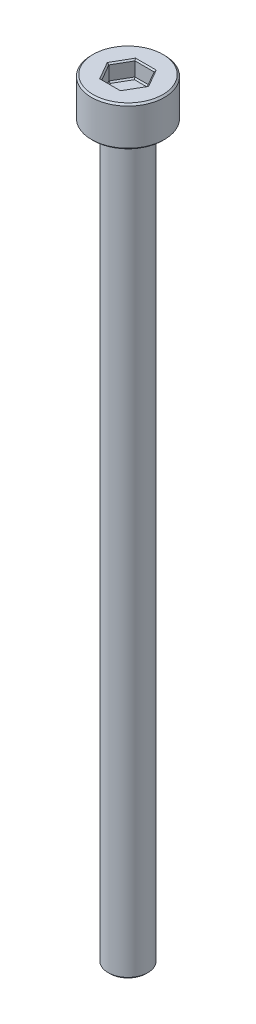
ISO-10303-21;
HEADER;
FILE_DESCRIPTION(('STEP AP214'),'2;1');
FILE_NAME('part.step','',(''),(''),'','','');
FILE_SCHEMA(('AUTOMOTIVE_DESIGN { 1 0 10303 214 1 1 1 1 }'));
ENDSEC;
DATA;
#1=APPLICATION_CONTEXT('core data for automotive mechanical design processes');
#2=APPLICATION_PROTOCOL_DEFINITION('international standard','automotive_design',2000,#1);
#3=PRODUCT_CONTEXT('',#1,'mechanical');
#4=PRODUCT('Part','Part','',(#3));
#5=PRODUCT_RELATED_PRODUCT_CATEGORY('part','',(#4));
#6=PRODUCT_DEFINITION_FORMATION('','',#4);
#7=PRODUCT_DEFINITION_CONTEXT('part definition',#1,'design');
#8=PRODUCT_DEFINITION('design','',#6,#7);
#9=PRODUCT_DEFINITION_SHAPE('','',#8);
#10=(LENGTH_UNIT() NAMED_UNIT(*) SI_UNIT(.MILLI.,.METRE.));
#11=(NAMED_UNIT(*) PLANE_ANGLE_UNIT() SI_UNIT($,.RADIAN.));
#12=(NAMED_UNIT(*) SI_UNIT($,.STERADIAN.) SOLID_ANGLE_UNIT());
#13=UNCERTAINTY_MEASURE_WITH_UNIT(LENGTH_MEASURE(1.E-05),#10,'distance_accuracy_value','');
#14=(GEOMETRIC_REPRESENTATION_CONTEXT(3) GLOBAL_UNCERTAINTY_ASSIGNED_CONTEXT((#13)) GLOBAL_UNIT_ASSIGNED_CONTEXT((#10,
#11,#12)) REPRESENTATION_CONTEXT('',''));
#15=CARTESIAN_POINT('',(0.,0.,0.));
#16=DIRECTION('',(0.,0.,1.));
#17=DIRECTION('',(1.,0.,0.));
#18=AXIS2_PLACEMENT_3D('',#15,#16,#17);
#19=CARTESIAN_POINT('',(0.,3.,0.));
#20=DIRECTION('',(0.,-1.,0.));
#21=DIRECTION('',(0.,0.,-1.));
#22=AXIS2_PLACEMENT_3D('',#19,#20,#21);
#23=CYLINDRICAL_SURFACE('',#22,2.75);
#24=CARTESIAN_POINT('',(0.,0.124999999999995,0.));
#25=DIRECTION('',(0.,1.,0.));
#26=DIRECTION('',(0.,0.,1.));
#27=AXIS2_PLACEMENT_3D('',#24,#25,#26);
#28=CIRCLE('',#27,2.75);
#29=CARTESIAN_POINT('',(0.,0.124999999999995,2.75));
#30=VERTEX_POINT('',#29);
#31=EDGE_CURVE('E274',#30,#30,#28,.T.);
#32=ORIENTED_EDGE('',*,*,#31,.T.);
#33=EDGE_LOOP('',(#32));
#34=FACE_BOUND('',#33,.T.);
#35=CARTESIAN_POINT('',(0.,2.87500000000001,0.));
#36=DIRECTION('',(0.,1.,0.));
#37=DIRECTION('',(0.,0.,1.));
#38=AXIS2_PLACEMENT_3D('',#35,#36,#37);
#39=CIRCLE('',#38,2.75);
#40=CARTESIAN_POINT('',(0.,2.87500000000001,2.75));
#41=VERTEX_POINT('',#40);
#42=EDGE_CURVE('E271',#41,#41,#39,.F.);
#43=ORIENTED_EDGE('',*,*,#42,.T.);
#44=EDGE_LOOP('',(#43));
#45=FACE_BOUND('',#44,.T.);
#46=ADVANCED_FACE('F43',(#34,#45),#23,.T.);
#47=CARTESIAN_POINT('',(0.,3.,0.));
#48=DIRECTION('',(0.,1.,0.));
#49=DIRECTION('',(0.,0.,1.));
#50=AXIS2_PLACEMENT_3D('',#47,#48,#49);
#51=PLANE('',#50);
#52=DIRECTION('',(-0.5,0.,0.866025403784439));
#53=VECTOR('',#52,1.);
#54=CARTESIAN_POINT('',(0.808290376865479,3.,1.3));
#55=LINE('',#54,#53);
#56=CARTESIAN_POINT('',(1.55884572681199,3.,0.));
#57=VERTEX_POINT('',#56);
#58=CARTESIAN_POINT('',(0.779422863405997,3.,1.35));
#59=VERTEX_POINT('',#58);
#60=EDGE_CURVE('E186',#57,#59,#55,.T.);
#61=ORIENTED_EDGE('',*,*,#60,.T.);
#62=DIRECTION('',(-1.,0.,0.));
#63=VECTOR('',#62,1.);
#64=CARTESIAN_POINT('',(-0.721687836487032,3.,1.35));
#65=LINE('',#64,#63);
#66=CARTESIAN_POINT('',(-0.779422863405996,3.,1.35));
#67=VERTEX_POINT('',#66);
#68=EDGE_CURVE('E158',#59,#67,#65,.T.);
#69=ORIENTED_EDGE('',*,*,#68,.T.);
#70=DIRECTION('',(-0.5,0.,-0.866025403784439));
#71=VECTOR('',#70,1.);
#72=CARTESIAN_POINT('',(-1.52997821335251,3.,0.0500000000000014));
#73=LINE('',#72,#71);
#74=CARTESIAN_POINT('',(-1.55884572681199,3.,0.));
#75=VERTEX_POINT('',#74);
#76=EDGE_CURVE('E182',#67,#75,#73,.T.);
#77=ORIENTED_EDGE('',*,*,#76,.T.);
#78=DIRECTION('',(0.5,0.,-0.866025403784439));
#79=VECTOR('',#78,1.);
#80=CARTESIAN_POINT('',(-0.808290376865479,3.,-1.3));
#81=LINE('',#80,#79);
#82=CARTESIAN_POINT('',(-0.779422863405997,3.,-1.35));
#83=VERTEX_POINT('',#82);
#84=EDGE_CURVE('E174',#75,#83,#81,.T.);
#85=ORIENTED_EDGE('',*,*,#84,.T.);
#86=DIRECTION('',(1.,0.,0.));
#87=VECTOR('',#86,1.);
#88=CARTESIAN_POINT('',(0.721687836487032,3.,-1.35));
#89=LINE('',#88,#87);
#90=CARTESIAN_POINT('',(0.779422863405996,3.,-1.35));
#91=VERTEX_POINT('',#90);
#92=EDGE_CURVE('E171',#83,#91,#89,.T.);
#93=ORIENTED_EDGE('',*,*,#92,.T.);
#94=DIRECTION('',(0.5,0.,0.866025403784439));
#95=VECTOR('',#94,1.);
#96=CARTESIAN_POINT('',(1.52997821335251,3.,-0.0500000000000015));
#97=LINE('',#96,#95);
#98=EDGE_CURVE('E184',#91,#57,#97,.T.);
#99=ORIENTED_EDGE('',*,*,#98,.T.);
#100=EDGE_LOOP('',(#61,#69,#77,#85,#93,#99));
#101=FACE_BOUND('',#100,.T.);
#102=CARTESIAN_POINT('',(0.,3.,0.));
#103=DIRECTION('',(0.,1.,0.));
#104=DIRECTION('',(0.,0.,1.));
#105=AXIS2_PLACEMENT_3D('',#102,#103,#104);
#106=CIRCLE('',#105,2.62500000000001);
#107=CARTESIAN_POINT('',(0.,3.,2.62500000000001));
#108=VERTEX_POINT('',#107);
#109=EDGE_CURVE('E280',#108,#108,#106,.T.);
#110=ORIENTED_EDGE('',*,*,#109,.T.);
#111=EDGE_LOOP('',(#110));
#112=FACE_BOUND('',#111,.T.);
#113=ADVANCED_FACE('F306',(#101,#112),#51,.T.);
#114=CARTESIAN_POINT('',(0.,0.,0.));
#115=DIRECTION('',(0.,1.,0.));
#116=DIRECTION('',(0.,0.,1.));
#117=AXIS2_PLACEMENT_3D('',#114,#115,#116);
#118=PLANE('',#117);
#119=CARTESIAN_POINT('',(0.,0.,0.));
#120=DIRECTION('',(0.,1.,0.));
#121=DIRECTION('',(0.,0.,1.));
#122=AXIS2_PLACEMENT_3D('',#119,#120,#121);
#123=CIRCLE('',#122,2.625);
#124=CARTESIAN_POINT('',(0.,0.,2.625));
#125=VERTEX_POINT('',#124);
#126=EDGE_CURVE('E277',#125,#125,#123,.F.);
#127=ORIENTED_EDGE('',*,*,#126,.T.);
#128=EDGE_LOOP('',(#127));
#129=FACE_BOUND('',#128,.T.);
#130=CARTESIAN_POINT('',(0.,0.,0.));
#131=DIRECTION('',(0.,-1.,0.));
#132=DIRECTION('',(0.,0.,-1.));
#133=AXIS2_PLACEMENT_3D('',#130,#131,#132);
#134=CIRCLE('',#133,1.5);
#135=CARTESIAN_POINT('',(0.,0.,-1.5));
#136=VERTEX_POINT('',#135);
#137=EDGE_CURVE('E147',#136,#136,#134,.T.);
#138=ORIENTED_EDGE('',*,*,#137,.F.);
#139=EDGE_LOOP('',(#138));
#140=FACE_BOUND('',#139,.T.);
#141=ADVANCED_FACE('F312',(#129,#140),#118,.F.);
#142=CARTESIAN_POINT('',(0.,-55.,0.));
#143=DIRECTION('',(0.,1.,0.));
#144=DIRECTION('',(0.,0.,1.));
#145=AXIS2_PLACEMENT_3D('',#142,#143,#144);
#146=CYLINDRICAL_SURFACE('',#145,1.5);
#147=CARTESIAN_POINT('',(0.,-54.875,0.));
#148=DIRECTION('',(0.,-1.,0.));
#149=DIRECTION('',(0.,0.,-1.));
#150=AXIS2_PLACEMENT_3D('',#147,#148,#149);
#151=CIRCLE('',#150,1.5);
#152=CARTESIAN_POINT('',(0.,-54.875,-1.5));
#153=VERTEX_POINT('',#152);
#154=EDGE_CURVE('E172',#153,#153,#151,.F.);
#155=ORIENTED_EDGE('',*,*,#154,.T.);
#156=EDGE_LOOP('',(#155));
#157=FACE_BOUND('',#156,.T.);
#158=ORIENTED_EDGE('',*,*,#137,.T.);
#159=EDGE_LOOP('',(#158));
#160=FACE_BOUND('',#159,.T.);
#161=ADVANCED_FACE('F432',(#157,#160),#146,.T.);
#162=CARTESIAN_POINT('',(0.,-55.,0.));
#163=DIRECTION('',(0.,-1.,0.));
#164=DIRECTION('',(0.,0.,-1.));
#165=AXIS2_PLACEMENT_3D('',#162,#163,#164);
#166=PLANE('',#165);
#167=CARTESIAN_POINT('',(0.,-55.,0.));
#168=DIRECTION('',(0.,-1.,0.));
#169=DIRECTION('',(0.,0.,-1.));
#170=AXIS2_PLACEMENT_3D('',#167,#168,#169);
#171=CIRCLE('',#170,1.37500000000001);
#172=CARTESIAN_POINT('',(0.,-55.,-1.37500000000001));
#173=VERTEX_POINT('',#172);
#174=EDGE_CURVE('E177',#173,#173,#171,.T.);
#175=ORIENTED_EDGE('',*,*,#174,.T.);
#176=EDGE_LOOP('',(#175));
#177=FACE_BOUND('',#176,.T.);
#178=ADVANCED_FACE('F285',(#177),#166,.T.);
#179=CARTESIAN_POINT('',(0.,0.124999999999995,0.));
#180=DIRECTION('',(0.,1.,0.));
#181=DIRECTION('',(0.,0.,1.));
#182=AXIS2_PLACEMENT_3D('',#179,#180,#181);
#183=CONICAL_SURFACE('',#182,2.75,0.785398163397459);
#184=ORIENTED_EDGE('',*,*,#126,.F.);
#185=EDGE_LOOP('',(#184));
#186=FACE_BOUND('',#185,.T.);
#187=ORIENTED_EDGE('',*,*,#31,.F.);
#188=EDGE_LOOP('',(#187));
#189=FACE_BOUND('',#188,.T.);
#190=ADVANCED_FACE('F299',(#186,#189),#183,.T.);
#191=CARTESIAN_POINT('',(0.,3.,0.));
#192=DIRECTION('',(0.,-1.,0.));
#193=DIRECTION('',(0.,0.,-1.));
#194=AXIS2_PLACEMENT_3D('',#191,#192,#193);
#195=CONICAL_SURFACE('',#194,2.62500000000001,0.785398163397466);
#196=ORIENTED_EDGE('',*,*,#42,.F.);
#197=EDGE_LOOP('',(#196));
#198=FACE_BOUND('',#197,.T.);
#199=ORIENTED_EDGE('',*,*,#109,.F.);
#200=EDGE_LOOP('',(#199));
#201=FACE_BOUND('',#200,.T.);
#202=ADVANCED_FACE('F289',(#198,#201),#195,.T.);
#203=CARTESIAN_POINT('',(0.,-55.,0.));
#204=DIRECTION('',(0.,1.,0.));
#205=DIRECTION('',(0.,0.,1.));
#206=AXIS2_PLACEMENT_3D('',#203,#204,#205);
#207=CONICAL_SURFACE('',#206,1.37500000000001,0.785398163397444);
#208=ORIENTED_EDGE('',*,*,#154,.F.);
#209=EDGE_LOOP('',(#208));
#210=FACE_BOUND('',#209,.T.);
#211=ORIENTED_EDGE('',*,*,#174,.F.);
#212=EDGE_LOOP('',(#211));
#213=FACE_BOUND('',#212,.T.);
#214=ADVANCED_FACE('F287',(#210,#213),#207,.T.);
#215=CARTESIAN_POINT('',(0.721687836487033,1.75,1.25));
#216=DIRECTION('',(0.866025403784439,0.,0.5));
#217=DIRECTION('',(0.5,0.,-0.866025403784439));
#218=AXIS2_PLACEMENT_3D('',#215,#216,#217);
#219=PLANE('',#218);
#220=DIRECTION('',(0.,1.,0.));
#221=VECTOR('',#220,1.);
#222=CARTESIAN_POINT('',(1.44337567297407,1.75,0.));
#223=LINE('',#222,#221);
#224=CARTESIAN_POINT('',(1.44337567297407,1.84999999999999,0.));
#225=VERTEX_POINT('',#224);
#226=CARTESIAN_POINT('',(1.44337567297407,2.9,0.));
#227=VERTEX_POINT('',#226);
#228=EDGE_CURVE('E211',#225,#227,#223,.T.);
#229=ORIENTED_EDGE('',*,*,#228,.F.);
#230=DIRECTION('',(-0.5,0.,0.866025403784439));
#231=VECTOR('',#230,1.);
#232=CARTESIAN_POINT('',(0.721687836487033,1.84999999999999,1.25));
#233=LINE('',#232,#231);
#234=CARTESIAN_POINT('',(0.721687836487033,1.84999999999999,1.25));
#235=VERTEX_POINT('',#234);
#236=EDGE_CURVE('E142',#225,#235,#233,.T.);
#237=ORIENTED_EDGE('',*,*,#236,.T.);
#238=DIRECTION('',(0.,1.,0.));
#239=VECTOR('',#238,1.);
#240=CARTESIAN_POINT('',(0.721687836487033,1.75,1.25));
#241=LINE('',#240,#239);
#242=CARTESIAN_POINT('',(0.721687836487033,2.9,1.25));
#243=VERTEX_POINT('',#242);
#244=EDGE_CURVE('E134',#235,#243,#241,.T.);
#245=ORIENTED_EDGE('',*,*,#244,.T.);
#246=DIRECTION('',(0.5,0.,-0.866025403784439));
#247=VECTOR('',#246,1.);
#248=CARTESIAN_POINT('',(1.44337567297407,2.9,0.));
#249=LINE('',#248,#247);
#250=EDGE_CURVE('E139',#243,#227,#249,.T.);
#251=ORIENTED_EDGE('',*,*,#250,.T.);
#252=EDGE_LOOP('',(#229,#237,#245,#251));
#253=FACE_BOUND('',#252,.T.);
#254=ADVANCED_FACE('F137',(#253),#219,.F.);
#255=CARTESIAN_POINT('',(-0.721687836487032,1.75,1.25));
#256=DIRECTION('',(0.,0.,1.));
#257=DIRECTION('',(1.,0.,0.));
#258=AXIS2_PLACEMENT_3D('',#255,#256,#257);
#259=PLANE('',#258);
#260=ORIENTED_EDGE('',*,*,#244,.F.);
#261=DIRECTION('',(-1.,0.,0.));
#262=VECTOR('',#261,1.);
#263=CARTESIAN_POINT('',(-0.721687836487032,1.84999999999999,1.25));
#264=LINE('',#263,#262);
#265=CARTESIAN_POINT('',(-0.721687836487032,1.84999999999999,1.25));
#266=VERTEX_POINT('',#265);
#267=EDGE_CURVE('E224',#235,#266,#264,.T.);
#268=ORIENTED_EDGE('',*,*,#267,.T.);
#269=DIRECTION('',(0.,1.,0.));
#270=VECTOR('',#269,1.);
#271=CARTESIAN_POINT('',(-0.721687836487032,1.75,1.25));
#272=LINE('',#271,#270);
#273=CARTESIAN_POINT('',(-0.721687836487032,2.9,1.25));
#274=VERTEX_POINT('',#273);
#275=EDGE_CURVE('E148',#266,#274,#272,.T.);
#276=ORIENTED_EDGE('',*,*,#275,.T.);
#277=DIRECTION('',(1.,0.,0.));
#278=VECTOR('',#277,1.);
#279=CARTESIAN_POINT('',(0.721687836487033,2.9,1.25));
#280=LINE('',#279,#278);
#281=EDGE_CURVE('E156',#274,#243,#280,.T.);
#282=ORIENTED_EDGE('',*,*,#281,.T.);
#283=EDGE_LOOP('',(#260,#268,#276,#282));
#284=FACE_BOUND('',#283,.T.);
#285=ADVANCED_FACE('F169',(#284),#259,.F.);
#286=CARTESIAN_POINT('',(-1.44337567297407,1.75,0.));
#287=DIRECTION('',(-0.866025403784439,0.,0.5));
#288=DIRECTION('',(0.5,0.,0.866025403784439));
#289=AXIS2_PLACEMENT_3D('',#286,#287,#288);
#290=PLANE('',#289);
#291=ORIENTED_EDGE('',*,*,#275,.F.);
#292=DIRECTION('',(-0.5,0.,-0.866025403784439));
#293=VECTOR('',#292,1.);
#294=CARTESIAN_POINT('',(-1.44337567297407,1.84999999999999,0.));
#295=LINE('',#294,#293);
#296=CARTESIAN_POINT('',(-1.44337567297407,1.84999999999999,0.));
#297=VERTEX_POINT('',#296);
#298=EDGE_CURVE('E68',#266,#297,#295,.T.);
#299=ORIENTED_EDGE('',*,*,#298,.T.);
#300=DIRECTION('',(0.,1.,0.));
#301=VECTOR('',#300,1.);
#302=CARTESIAN_POINT('',(-1.44337567297407,1.75,0.));
#303=LINE('',#302,#301);
#304=CARTESIAN_POINT('',(-1.44337567297407,2.9,0.));
#305=VERTEX_POINT('',#304);
#306=EDGE_CURVE('E264',#297,#305,#303,.T.);
#307=ORIENTED_EDGE('',*,*,#306,.T.);
#308=DIRECTION('',(0.5,0.,0.866025403784439));
#309=VECTOR('',#308,1.);
#310=CARTESIAN_POINT('',(-0.721687836487032,2.9,1.25));
#311=LINE('',#310,#309);
#312=EDGE_CURVE('E191',#305,#274,#311,.T.);
#313=ORIENTED_EDGE('',*,*,#312,.T.);
#314=EDGE_LOOP('',(#291,#299,#307,#313));
#315=FACE_BOUND('',#314,.T.);
#316=ADVANCED_FACE('F391',(#315),#290,.F.);
#317=CARTESIAN_POINT('',(-0.721687836487033,1.75,-1.25));
#318=DIRECTION('',(-0.866025403784439,0.,-0.5));
#319=DIRECTION('',(-0.5,0.,0.866025403784439));
#320=AXIS2_PLACEMENT_3D('',#317,#318,#319);
#321=PLANE('',#320);
#322=ORIENTED_EDGE('',*,*,#306,.F.);
#323=DIRECTION('',(0.5,0.,-0.866025403784439));
#324=VECTOR('',#323,1.);
#325=CARTESIAN_POINT('',(-0.721687836487033,1.84999999999999,-1.25));
#326=LINE('',#325,#324);
#327=CARTESIAN_POINT('',(-0.721687836487033,1.84999999999999,-1.25));
#328=VERTEX_POINT('',#327);
#329=EDGE_CURVE('E53',#297,#328,#326,.T.);
#330=ORIENTED_EDGE('',*,*,#329,.T.);
#331=DIRECTION('',(0.,1.,0.));
#332=VECTOR('',#331,1.);
#333=CARTESIAN_POINT('',(-0.721687836487033,1.75,-1.25));
#334=LINE('',#333,#332);
#335=CARTESIAN_POINT('',(-0.721687836487033,2.9,-1.25));
#336=VERTEX_POINT('',#335);
#337=EDGE_CURVE('E259',#328,#336,#334,.T.);
#338=ORIENTED_EDGE('',*,*,#337,.T.);
#339=DIRECTION('',(-0.5,0.,0.866025403784439));
#340=VECTOR('',#339,1.);
#341=CARTESIAN_POINT('',(-1.44337567297407,2.9,0.));
#342=LINE('',#341,#340);
#343=EDGE_CURVE('E193',#336,#305,#342,.T.);
#344=ORIENTED_EDGE('',*,*,#343,.T.);
#345=EDGE_LOOP('',(#322,#330,#338,#344));
#346=FACE_BOUND('',#345,.T.);
#347=ADVANCED_FACE('F397',(#346),#321,.F.);
#348=CARTESIAN_POINT('',(0.721687836487032,1.75,-1.25));
#349=DIRECTION('',(0.,0.,-1.));
#350=DIRECTION('',(-1.,0.,0.));
#351=AXIS2_PLACEMENT_3D('',#348,#349,#350);
#352=PLANE('',#351);
#353=ORIENTED_EDGE('',*,*,#337,.F.);
#354=DIRECTION('',(1.,0.,0.));
#355=VECTOR('',#354,1.);
#356=CARTESIAN_POINT('',(0.721687836487032,1.84999999999999,-1.25));
#357=LINE('',#356,#355);
#358=CARTESIAN_POINT('',(0.721687836487032,1.84999999999999,-1.25));
#359=VERTEX_POINT('',#358);
#360=EDGE_CURVE('E11',#328,#359,#357,.T.);
#361=ORIENTED_EDGE('',*,*,#360,.T.);
#362=DIRECTION('',(0.,1.,0.));
#363=VECTOR('',#362,1.);
#364=CARTESIAN_POINT('',(0.721687836487032,1.75,-1.25));
#365=LINE('',#364,#363);
#366=CARTESIAN_POINT('',(0.721687836487032,2.9,-1.25));
#367=VERTEX_POINT('',#366);
#368=EDGE_CURVE('E258',#359,#367,#365,.T.);
#369=ORIENTED_EDGE('',*,*,#368,.T.);
#370=DIRECTION('',(-1.,0.,0.));
#371=VECTOR('',#370,1.);
#372=CARTESIAN_POINT('',(-0.721687836487033,2.9,-1.25));
#373=LINE('',#372,#371);
#374=EDGE_CURVE('E196',#367,#336,#373,.T.);
#375=ORIENTED_EDGE('',*,*,#374,.T.);
#376=EDGE_LOOP('',(#353,#361,#369,#375));
#377=FACE_BOUND('',#376,.T.);
#378=ADVANCED_FACE('F257',(#377),#352,.F.);
#379=CARTESIAN_POINT('',(1.44337567297407,1.75,0.));
#380=DIRECTION('',(0.866025403784439,0.,-0.5));
#381=DIRECTION('',(-0.5,0.,-0.866025403784439));
#382=AXIS2_PLACEMENT_3D('',#379,#380,#381);
#383=PLANE('',#382);
#384=ORIENTED_EDGE('',*,*,#368,.F.);
#385=DIRECTION('',(0.5,0.,0.866025403784439));
#386=VECTOR('',#385,1.);
#387=CARTESIAN_POINT('',(1.44337567297407,1.84999999999999,0.));
#388=LINE('',#387,#386);
#389=EDGE_CURVE('E227',#359,#225,#388,.T.);
#390=ORIENTED_EDGE('',*,*,#389,.T.);
#391=ORIENTED_EDGE('',*,*,#228,.T.);
#392=DIRECTION('',(-0.5,0.,-0.866025403784439));
#393=VECTOR('',#392,1.);
#394=CARTESIAN_POINT('',(0.721687836487032,2.9,-1.25));
#395=LINE('',#394,#393);
#396=EDGE_CURVE('E167',#227,#367,#395,.T.);
#397=ORIENTED_EDGE('',*,*,#396,.T.);
#398=EDGE_LOOP('',(#384,#390,#391,#397));
#399=FACE_BOUND('',#398,.T.);
#400=ADVANCED_FACE('F261',(#399),#383,.F.);
#401=CARTESIAN_POINT('',(0.,1.75,0.));
#402=DIRECTION('',(0.,1.,0.));
#403=DIRECTION('',(0.,0.,1.));
#404=AXIS2_PLACEMENT_3D('',#401,#402,#403);
#405=PLANE('',#404);
#406=DIRECTION('',(0.5,0.,0.866025403784439));
#407=VECTOR('',#406,1.);
#408=CARTESIAN_POINT('',(-0.995929214352115,1.75,0.575000000000006));
#409=LINE('',#408,#407);
#410=CARTESIAN_POINT('',(-1.32790561913615,1.75,0.));
#411=VERTEX_POINT('',#410);
#412=CARTESIAN_POINT('',(-0.663952809568076,1.75,1.15000000000001));
#413=VERTEX_POINT('',#412);
#414=EDGE_CURVE('E215',#411,#413,#409,.T.);
#415=ORIENTED_EDGE('',*,*,#414,.T.);
#416=DIRECTION('',(1.,0.,0.));
#417=VECTOR('',#416,1.);
#418=CARTESIAN_POINT('',(0.,1.75,1.15000000000001));
#419=LINE('',#418,#417);
#420=CARTESIAN_POINT('',(0.663952809568076,1.75,1.15000000000001));
#421=VERTEX_POINT('',#420);
#422=EDGE_CURVE('E221',#413,#421,#419,.T.);
#423=ORIENTED_EDGE('',*,*,#422,.T.);
#424=DIRECTION('',(0.5,0.,-0.866025403784439));
#425=VECTOR('',#424,1.);
#426=CARTESIAN_POINT('',(0.995929214352115,1.75,0.575000000000005));
#427=LINE('',#426,#425);
#428=CARTESIAN_POINT('',(1.32790561913615,1.75,0.));
#429=VERTEX_POINT('',#428);
#430=EDGE_CURVE('E219',#421,#429,#427,.T.);
#431=ORIENTED_EDGE('',*,*,#430,.T.);
#432=DIRECTION('',(-0.5,0.,-0.866025403784439));
#433=VECTOR('',#432,1.);
#434=CARTESIAN_POINT('',(0.995929214352115,1.75,-0.575000000000006));
#435=LINE('',#434,#433);
#436=CARTESIAN_POINT('',(0.663952809568077,1.75,-1.15000000000001));
#437=VERTEX_POINT('',#436);
#438=EDGE_CURVE('E217',#429,#437,#435,.T.);
#439=ORIENTED_EDGE('',*,*,#438,.T.);
#440=DIRECTION('',(-1.,0.,0.));
#441=VECTOR('',#440,1.);
#442=CARTESIAN_POINT('',(0.,1.75,-1.15000000000001));
#443=LINE('',#442,#441);
#444=CARTESIAN_POINT('',(-0.663952809568077,1.75,-1.15000000000001));
#445=VERTEX_POINT('',#444);
#446=EDGE_CURVE('E198',#437,#445,#443,.T.);
#447=ORIENTED_EDGE('',*,*,#446,.T.);
#448=DIRECTION('',(-0.5,0.,0.866025403784439));
#449=VECTOR('',#448,1.);
#450=CARTESIAN_POINT('',(-0.995929214352115,1.75,-0.575000000000005));
#451=LINE('',#450,#449);
#452=EDGE_CURVE('E213',#445,#411,#451,.T.);
#453=ORIENTED_EDGE('',*,*,#452,.T.);
#454=EDGE_LOOP('',(#415,#423,#431,#439,#447,#453));
#455=FACE_BOUND('',#454,.T.);
#456=ADVANCED_FACE('F410',(#455),#405,.T.);
#457=CARTESIAN_POINT('',(0.721687836487032,2.9,-1.25));
#458=DIRECTION('',(0.,0.707106781186547,0.707106781186548));
#459=DIRECTION('',(1.,0.,0.));
#460=AXIS2_PLACEMENT_3D('',#457,#458,#459);
#461=PLANE('',#460);
#462=DIRECTION('',(0.377964473009226,0.654653670707978,-0.654653670707977));
#463=VECTOR('',#462,1.);
#464=CARTESIAN_POINT('',(0.515491311776452,2.54285714285714,-0.892857142857143));
#465=LINE('',#464,#463);
#466=EDGE_CURVE('E205',#91,#367,#465,.F.);
#467=ORIENTED_EDGE('',*,*,#466,.F.);
#468=ORIENTED_EDGE('',*,*,#92,.F.);
#469=DIRECTION('',(0.377964473009229,-0.654653670707977,0.654653670707976));
#470=VECTOR('',#469,1.);
#471=CARTESIAN_POINT('',(-0.721687836487033,2.9,-1.25));
#472=LINE('',#471,#470);
#473=EDGE_CURVE('E208',#336,#83,#472,.F.);
#474=ORIENTED_EDGE('',*,*,#473,.F.);
#475=ORIENTED_EDGE('',*,*,#374,.F.);
#476=EDGE_LOOP('',(#467,#468,#474,#475));
#477=FACE_BOUND('',#476,.T.);
#478=ADVANCED_FACE('F333',(#477),#461,.T.);
#479=CARTESIAN_POINT('',(-0.721687836487033,2.9,-1.25));
#480=DIRECTION('',(0.612372435695794,0.707106781186548,0.353553390593273));
#481=DIRECTION('',(0.5,0.,-0.866025403784439));
#482=AXIS2_PLACEMENT_3D('',#479,#480,#481);
#483=PLANE('',#482);
#484=ORIENTED_EDGE('',*,*,#473,.T.);
#485=ORIENTED_EDGE('',*,*,#84,.F.);
#486=DIRECTION('',(0.755928946018454,-0.654653670707977,0.));
#487=VECTOR('',#486,1.);
#488=CARTESIAN_POINT('',(-1.44337567297407,2.9,0.));
#489=LINE('',#488,#487);
#490=EDGE_CURVE('E202',#305,#75,#489,.F.);
#491=ORIENTED_EDGE('',*,*,#490,.F.);
#492=ORIENTED_EDGE('',*,*,#343,.F.);
#493=EDGE_LOOP('',(#484,#485,#491,#492));
#494=FACE_BOUND('',#493,.T.);
#495=ADVANCED_FACE('F339',(#494),#483,.T.);
#496=CARTESIAN_POINT('',(1.44337567297407,2.9,0.));
#497=DIRECTION('',(-0.612372435695795,0.707106781186546,0.353553390593274));
#498=DIRECTION('',(0.5,0.,0.866025403784439));
#499=AXIS2_PLACEMENT_3D('',#496,#497,#498);
#500=PLANE('',#499);
#501=ORIENTED_EDGE('',*,*,#466,.T.);
#502=ORIENTED_EDGE('',*,*,#396,.F.);
#503=DIRECTION('',(0.755928946018454,0.654653670707978,0.));
#504=VECTOR('',#503,1.);
#505=CARTESIAN_POINT('',(1.03098262355291,2.54285714285714,0.));
#506=LINE('',#505,#504);
#507=EDGE_CURVE('E166',#57,#227,#506,.F.);
#508=ORIENTED_EDGE('',*,*,#507,.F.);
#509=ORIENTED_EDGE('',*,*,#98,.F.);
#510=EDGE_LOOP('',(#501,#502,#508,#509));
#511=FACE_BOUND('',#510,.T.);
#512=ADVANCED_FACE('F344',(#511),#500,.T.);
#513=CARTESIAN_POINT('',(-1.44337567297407,2.9,0.));
#514=DIRECTION('',(0.612372435695795,0.707106781186547,-0.353553390593274));
#515=DIRECTION('',(-0.5,0.,-0.866025403784439));
#516=AXIS2_PLACEMENT_3D('',#513,#514,#515);
#517=PLANE('',#516);
#518=ORIENTED_EDGE('',*,*,#490,.T.);
#519=ORIENTED_EDGE('',*,*,#76,.F.);
#520=DIRECTION('',(0.377964473009226,-0.654653670707978,-0.654653670707978));
#521=VECTOR('',#520,1.);
#522=CARTESIAN_POINT('',(-0.721687836487032,2.9,1.25));
#523=LINE('',#522,#521);
#524=EDGE_CURVE('E161',#274,#67,#523,.F.);
#525=ORIENTED_EDGE('',*,*,#524,.F.);
#526=ORIENTED_EDGE('',*,*,#312,.F.);
#527=EDGE_LOOP('',(#518,#519,#525,#526));
#528=FACE_BOUND('',#527,.T.);
#529=ADVANCED_FACE('F349',(#528),#517,.T.);
#530=CARTESIAN_POINT('',(0.721687836487033,2.9,1.25));
#531=DIRECTION('',(-0.612372435695794,0.707106781186548,-0.353553390593274));
#532=DIRECTION('',(-0.5,0.,0.866025403784439));
#533=AXIS2_PLACEMENT_3D('',#530,#531,#532);
#534=PLANE('',#533);
#535=ORIENTED_EDGE('',*,*,#507,.T.);
#536=ORIENTED_EDGE('',*,*,#250,.F.);
#537=DIRECTION('',(0.377964473009228,0.654653670707977,0.654653670707977));
#538=VECTOR('',#537,1.);
#539=CARTESIAN_POINT('',(0.515491311776452,2.54285714285714,0.892857142857143));
#540=LINE('',#539,#538);
#541=EDGE_CURVE('E154',#59,#243,#540,.F.);
#542=ORIENTED_EDGE('',*,*,#541,.F.);
#543=ORIENTED_EDGE('',*,*,#60,.F.);
#544=EDGE_LOOP('',(#535,#536,#542,#543));
#545=FACE_BOUND('',#544,.T.);
#546=ADVANCED_FACE('F164',(#545),#534,.T.);
#547=CARTESIAN_POINT('',(-0.721687836487032,2.9,1.25));
#548=DIRECTION('',(0.,0.707106781186548,-0.707106781186548));
#549=DIRECTION('',(-1.,0.,0.));
#550=AXIS2_PLACEMENT_3D('',#547,#548,#549);
#551=PLANE('',#550);
#552=ORIENTED_EDGE('',*,*,#524,.T.);
#553=ORIENTED_EDGE('',*,*,#68,.F.);
#554=ORIENTED_EDGE('',*,*,#541,.T.);
#555=ORIENTED_EDGE('',*,*,#281,.F.);
#556=EDGE_LOOP('',(#552,#553,#554,#555));
#557=FACE_BOUND('',#556,.T.);
#558=ADVANCED_FACE('F155',(#557),#551,.T.);
#559=CARTESIAN_POINT('',(0.,1.75,-1.15000000000001));
#560=DIRECTION('',(0.,-0.707106781186548,-0.707106781186547));
#561=DIRECTION('',(-1.,0.,0.));
#562=AXIS2_PLACEMENT_3D('',#559,#560,#561);
#563=PLANE('',#562);
#564=DIRECTION('',(0.377964473009225,0.654653670707977,-0.654653670707978));
#565=VECTOR('',#564,1.);
#566=CARTESIAN_POINT('',(0.569102408201208,1.58571428571428,-0.985714285714295));
#567=LINE('',#566,#565);
#568=EDGE_CURVE('E240',#359,#437,#567,.F.);
#569=ORIENTED_EDGE('',*,*,#568,.F.);
#570=ORIENTED_EDGE('',*,*,#360,.F.);
#571=DIRECTION('',(0.377964473009229,-0.654653670707976,0.654653670707977));
#572=VECTOR('',#571,1.);
#573=CARTESIAN_POINT('',(-0.569102408201208,1.58571428571428,-0.985714285714296));
#574=LINE('',#573,#572);
#575=EDGE_CURVE('E48',#445,#328,#574,.F.);
#576=ORIENTED_EDGE('',*,*,#575,.F.);
#577=ORIENTED_EDGE('',*,*,#446,.F.);
#578=EDGE_LOOP('',(#569,#570,#576,#577));
#579=FACE_BOUND('',#578,.T.);
#580=ADVANCED_FACE('F46',(#579),#563,.F.);
#581=CARTESIAN_POINT('',(-0.995929214352115,1.75,-0.575000000000005));
#582=DIRECTION('',(-0.612372435695794,-0.707106781186549,-0.353553390593273));
#583=DIRECTION('',(-0.5,0.,0.866025403784439));
#584=AXIS2_PLACEMENT_3D('',#581,#582,#583);
#585=PLANE('',#584);
#586=ORIENTED_EDGE('',*,*,#575,.T.);
#587=ORIENTED_EDGE('',*,*,#329,.F.);
#588=DIRECTION('',(0.755928946018455,-0.654653670707977,0.));
#589=VECTOR('',#588,1.);
#590=CARTESIAN_POINT('',(-1.13820481640242,1.58571428571428,0.));
#591=LINE('',#590,#589);
#592=EDGE_CURVE('E238',#411,#297,#591,.F.);
#593=ORIENTED_EDGE('',*,*,#592,.F.);
#594=ORIENTED_EDGE('',*,*,#452,.F.);
#595=EDGE_LOOP('',(#586,#587,#593,#594));
#596=FACE_BOUND('',#595,.T.);
#597=ADVANCED_FACE('F250',(#596),#585,.F.);
#598=CARTESIAN_POINT('',(0.995929214352115,1.75,-0.575000000000006));
#599=DIRECTION('',(0.612372435695795,-0.707106781186547,-0.353553390593274));
#600=DIRECTION('',(-0.5,0.,-0.866025403784439));
#601=AXIS2_PLACEMENT_3D('',#598,#599,#600);
#602=PLANE('',#601);
#603=ORIENTED_EDGE('',*,*,#568,.T.);
#604=ORIENTED_EDGE('',*,*,#438,.F.);
#605=DIRECTION('',(0.755928946018454,0.654653670707977,0.));
#606=VECTOR('',#605,1.);
#607=CARTESIAN_POINT('',(1.13820481640242,1.58571428571428,0.));
#608=LINE('',#607,#606);
#609=EDGE_CURVE('E235',#225,#429,#608,.F.);
#610=ORIENTED_EDGE('',*,*,#609,.F.);
#611=ORIENTED_EDGE('',*,*,#389,.F.);
#612=EDGE_LOOP('',(#603,#604,#610,#611));
#613=FACE_BOUND('',#612,.T.);
#614=ADVANCED_FACE('F366',(#613),#602,.F.);
#615=CARTESIAN_POINT('',(-0.995929214352115,1.75,0.575000000000006));
#616=DIRECTION('',(-0.612372435695795,-0.707106781186547,0.353553390593274));
#617=DIRECTION('',(0.5,0.,0.866025403784439));
#618=AXIS2_PLACEMENT_3D('',#615,#616,#617);
#619=PLANE('',#618);
#620=ORIENTED_EDGE('',*,*,#592,.T.);
#621=ORIENTED_EDGE('',*,*,#298,.F.);
#622=DIRECTION('',(0.377964473009227,-0.654653670707977,-0.654653670707977));
#623=VECTOR('',#622,1.);
#624=CARTESIAN_POINT('',(-0.569102408201208,1.58571428571428,0.985714285714296));
#625=LINE('',#624,#623);
#626=EDGE_CURVE('E233',#413,#266,#625,.F.);
#627=ORIENTED_EDGE('',*,*,#626,.F.);
#628=ORIENTED_EDGE('',*,*,#414,.F.);
#629=EDGE_LOOP('',(#620,#621,#627,#628));
#630=FACE_BOUND('',#629,.T.);
#631=ADVANCED_FACE('F371',(#630),#619,.F.);
#632=CARTESIAN_POINT('',(0.995929214352115,1.75,0.575000000000006));
#633=DIRECTION('',(0.612372435695794,-0.707106781186548,0.353553390593273));
#634=DIRECTION('',(0.5,0.,-0.866025403784439));
#635=AXIS2_PLACEMENT_3D('',#632,#633,#634);
#636=PLANE('',#635);
#637=ORIENTED_EDGE('',*,*,#609,.T.);
#638=ORIENTED_EDGE('',*,*,#430,.F.);
#639=DIRECTION('',(0.377964473009228,0.654653670707977,0.654653670707977));
#640=VECTOR('',#639,1.);
#641=CARTESIAN_POINT('',(0.569102408201208,1.58571428571428,0.985714285714296));
#642=LINE('',#641,#640);
#643=EDGE_CURVE('E231',#235,#421,#642,.F.);
#644=ORIENTED_EDGE('',*,*,#643,.F.);
#645=ORIENTED_EDGE('',*,*,#236,.F.);
#646=EDGE_LOOP('',(#637,#638,#644,#645));
#647=FACE_BOUND('',#646,.T.);
#648=ADVANCED_FACE('F376',(#647),#636,.F.);
#649=CARTESIAN_POINT('',(0.,1.75,1.15000000000001));
#650=DIRECTION('',(0.,-0.707106781186548,0.707106781186548));
#651=DIRECTION('',(1.,0.,0.));
#652=AXIS2_PLACEMENT_3D('',#649,#650,#651);
#653=PLANE('',#652);
#654=ORIENTED_EDGE('',*,*,#626,.T.);
#655=ORIENTED_EDGE('',*,*,#267,.F.);
#656=ORIENTED_EDGE('',*,*,#643,.T.);
#657=ORIENTED_EDGE('',*,*,#422,.F.);
#658=EDGE_LOOP('',(#654,#655,#656,#657));
#659=FACE_BOUND('',#658,.T.);
#660=ADVANCED_FACE('F379',(#659),#653,.F.);
#661=CLOSED_SHELL('',(#46,#113,#141,#161,#178,#190,#202,#214,#254,#285,#316,#347,#378,#400,#456,
#478,#495,#512,#529,#546,#558,#580,#597,#614,#631,#648,#660));
#662=MANIFOLD_SOLID_BREP('B2',#661);
#663=ADVANCED_BREP_SHAPE_REPRESENTATION('',(#18,#662),#14);
#664=SHAPE_DEFINITION_REPRESENTATION(#9,#663);
ENDSEC;
END-ISO-10303-21;
